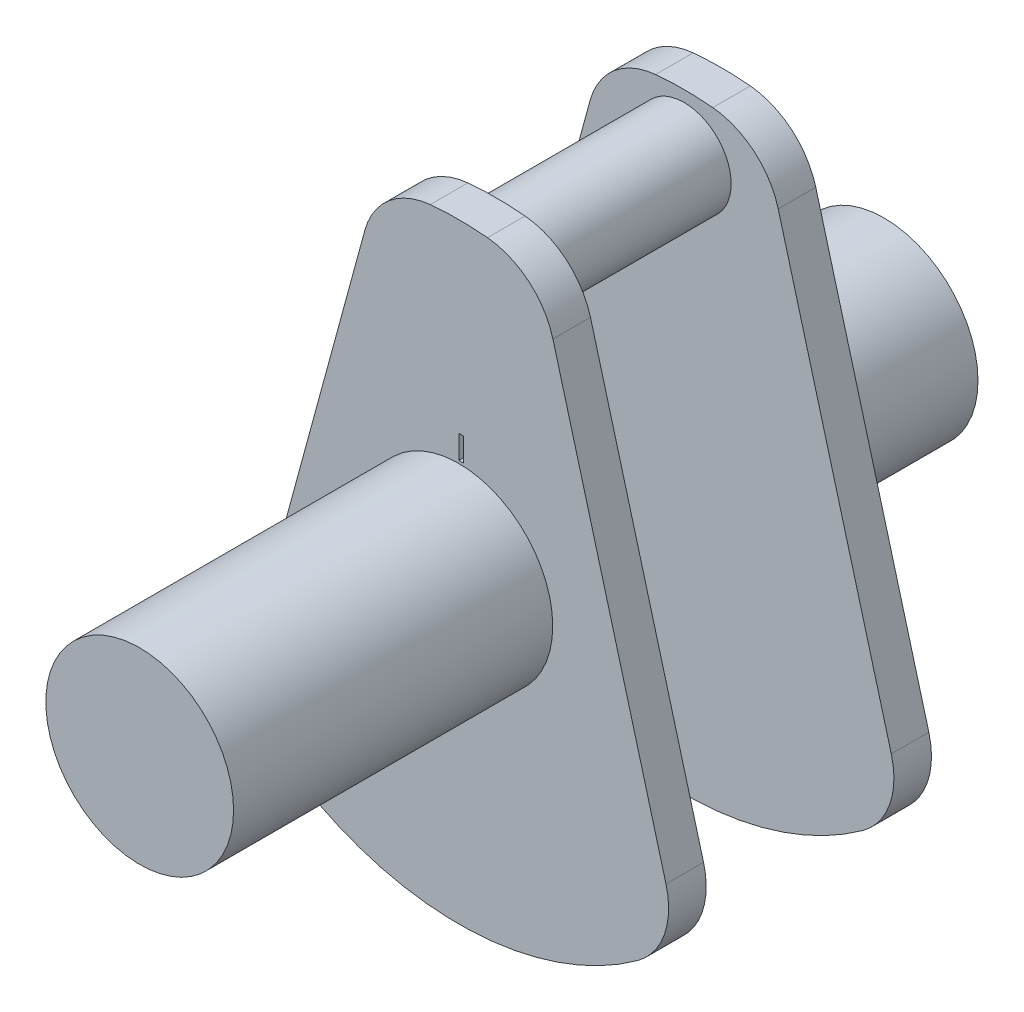
ISO-10303-21;
HEADER;
FILE_DESCRIPTION(('STEP AP214'),'2;1');
FILE_NAME('part.step','',(''),(''),'','','');
FILE_SCHEMA(('AUTOMOTIVE_DESIGN { 1 0 10303 214 1 1 1 1 }'));
ENDSEC;
DATA;
#1=APPLICATION_CONTEXT('core data for automotive mechanical design processes');
#2=APPLICATION_PROTOCOL_DEFINITION('international standard','automotive_design',2000,#1);
#3=PRODUCT_CONTEXT('',#1,'mechanical');
#4=PRODUCT('Part','Part','',(#3));
#5=PRODUCT_RELATED_PRODUCT_CATEGORY('part','',(#4));
#6=PRODUCT_DEFINITION_FORMATION('','',#4);
#7=PRODUCT_DEFINITION_CONTEXT('part definition',#1,'design');
#8=PRODUCT_DEFINITION('design','',#6,#7);
#9=PRODUCT_DEFINITION_SHAPE('','',#8);
#10=(LENGTH_UNIT() NAMED_UNIT(*) SI_UNIT(.MILLI.,.METRE.));
#11=(NAMED_UNIT(*) PLANE_ANGLE_UNIT() SI_UNIT($,.RADIAN.));
#12=(NAMED_UNIT(*) SI_UNIT($,.STERADIAN.) SOLID_ANGLE_UNIT());
#13=UNCERTAINTY_MEASURE_WITH_UNIT(LENGTH_MEASURE(1.E-05),#10,'distance_accuracy_value','');
#14=(GEOMETRIC_REPRESENTATION_CONTEXT(3) GLOBAL_UNCERTAINTY_ASSIGNED_CONTEXT((#13)) GLOBAL_UNIT_ASSIGNED_CONTEXT((#10,
#11,#12)) REPRESENTATION_CONTEXT('',''));
#15=CARTESIAN_POINT('',(0.,0.,0.));
#16=DIRECTION('',(0.,0.,1.));
#17=DIRECTION('',(1.,0.,0.));
#18=AXIS2_PLACEMENT_3D('',#15,#16,#17);
#19=CARTESIAN_POINT('',(0.46,4.87836038029172,0.8));
#20=DIRECTION('',(0.,0.,-1.));
#21=DIRECTION('',(-1.,0.,0.));
#22=AXIS2_PLACEMENT_3D('',#19,#20,#21);
#23=CYLINDRICAL_SURFACE('',#22,1.6);
#24=CARTESIAN_POINT('',(0.46,4.87836038029172,0.));
#25=DIRECTION('',(0.,0.,1.));
#26=DIRECTION('',(1.,0.,0.));
#27=AXIS2_PLACEMENT_3D('',#24,#25,#26);
#28=CIRCLE('',#27,1.6);
#29=CARTESIAN_POINT('',(2.00384320160388,5.29853673476862,0.));
#30=VERTEX_POINT('',#29);
#31=CARTESIAN_POINT('',(0.610204081632653,6.47129438201963,0.));
#32=VERTEX_POINT('',#31);
#33=EDGE_CURVE('E142',#30,#32,#28,.T.);
#34=ORIENTED_EDGE('',*,*,#33,.T.);
#35=DIRECTION('',(0.,0.,-1.));
#36=VECTOR('',#35,1.);
#37=CARTESIAN_POINT('',(0.610204081632653,6.47129438201963,0.8));
#38=LINE('',#37,#36);
#39=CARTESIAN_POINT('',(0.610204081632653,6.47129438201963,0.8));
#40=VERTEX_POINT('',#39);
#41=EDGE_CURVE('E40',#40,#32,#38,.T.);
#42=ORIENTED_EDGE('',*,*,#41,.F.);
#43=CARTESIAN_POINT('',(0.46,4.87836038029172,0.8));
#44=DIRECTION('',(0.,0.,1.));
#45=DIRECTION('',(1.,0.,0.));
#46=AXIS2_PLACEMENT_3D('',#43,#44,#45);
#47=CIRCLE('',#46,1.6);
#48=CARTESIAN_POINT('',(2.00384320160388,5.29853673476862,0.8));
#49=VERTEX_POINT('',#48);
#50=EDGE_CURVE('E158',#49,#40,#47,.T.);
#51=ORIENTED_EDGE('',*,*,#50,.F.);
#52=DIRECTION('',(0.,0.,-1.));
#53=VECTOR('',#52,1.);
#54=CARTESIAN_POINT('',(2.00384320160388,5.29853673476862,0.8));
#55=LINE('',#54,#53);
#56=EDGE_CURVE('E138',#49,#30,#55,.T.);
#57=ORIENTED_EDGE('',*,*,#56,.T.);
#58=EDGE_LOOP('',(#34,#42,#51,#57));
#59=FACE_BOUND('',#58,.T.);
#60=ADVANCED_FACE('F33',(#59),#23,.T.);
#61=CARTESIAN_POINT('',(0.,0.,0.8));
#62=DIRECTION('',(0.,0.,-1.));
#63=DIRECTION('',(-1.,0.,0.));
#64=AXIS2_PLACEMENT_3D('',#61,#62,#63);
#65=CYLINDRICAL_SURFACE('',#64,6.5);
#66=CARTESIAN_POINT('',(0.,0.,0.));
#67=DIRECTION('',(0.,0.,1.));
#68=DIRECTION('',(1.,0.,0.));
#69=AXIS2_PLACEMENT_3D('',#66,#67,#68);
#70=CIRCLE('',#69,6.5);
#71=CARTESIAN_POINT('',(-0.610204081632653,6.47129438201963,0.));
#72=VERTEX_POINT('',#71);
#73=EDGE_CURVE('E145',#32,#72,#70,.T.);
#74=ORIENTED_EDGE('',*,*,#73,.T.);
#75=DIRECTION('',(0.,0.,-1.));
#76=VECTOR('',#75,1.);
#77=CARTESIAN_POINT('',(-0.610204081632653,6.47129438201963,0.8));
#78=LINE('',#77,#76);
#79=CARTESIAN_POINT('',(-0.610204081632653,6.47129438201963,0.8));
#80=VERTEX_POINT('',#79);
#81=EDGE_CURVE('E168',#80,#72,#78,.T.);
#82=ORIENTED_EDGE('',*,*,#81,.F.);
#83=CARTESIAN_POINT('',(0.,0.,0.8));
#84=DIRECTION('',(0.,0.,1.));
#85=DIRECTION('',(1.,0.,0.));
#86=AXIS2_PLACEMENT_3D('',#83,#84,#85);
#87=CIRCLE('',#86,6.5);
#88=EDGE_CURVE('E98',#40,#80,#87,.T.);
#89=ORIENTED_EDGE('',*,*,#88,.F.);
#90=ORIENTED_EDGE('',*,*,#41,.T.);
#91=EDGE_LOOP('',(#74,#82,#89,#90));
#92=FACE_BOUND('',#91,.T.);
#93=ADVANCED_FACE('F171',(#92),#65,.T.);
#94=CARTESIAN_POINT('',(-0.46,4.87836038029172,0.8));
#95=DIRECTION('',(0.,0.,-1.));
#96=DIRECTION('',(-1.,0.,0.));
#97=AXIS2_PLACEMENT_3D('',#94,#95,#96);
#98=CYLINDRICAL_SURFACE('',#97,1.6);
#99=CARTESIAN_POINT('',(-0.46,4.87836038029172,0.));
#100=DIRECTION('',(0.,0.,1.));
#101=DIRECTION('',(-1.,0.,0.));
#102=AXIS2_PLACEMENT_3D('',#99,#100,#101);
#103=CIRCLE('',#102,1.6);
#104=CARTESIAN_POINT('',(-2.00384320160388,5.29853673476862,0.));
#105=VERTEX_POINT('',#104);
#106=EDGE_CURVE('E148',#72,#105,#103,.T.);
#107=ORIENTED_EDGE('',*,*,#106,.T.);
#108=DIRECTION('',(0.,0.,-1.));
#109=VECTOR('',#108,1.);
#110=CARTESIAN_POINT('',(-2.00384320160388,5.29853673476862,0.8));
#111=LINE('',#110,#109);
#112=CARTESIAN_POINT('',(-2.00384320160388,5.29853673476862,0.8));
#113=VERTEX_POINT('',#112);
#114=EDGE_CURVE('E165',#113,#105,#111,.T.);
#115=ORIENTED_EDGE('',*,*,#114,.F.);
#116=CARTESIAN_POINT('',(-0.46,4.87836038029172,0.8));
#117=DIRECTION('',(0.,0.,1.));
#118=DIRECTION('',(-1.,0.,0.));
#119=AXIS2_PLACEMENT_3D('',#116,#117,#118);
#120=CIRCLE('',#119,1.6);
#121=EDGE_CURVE('E189',#80,#113,#120,.T.);
#122=ORIENTED_EDGE('',*,*,#121,.F.);
#123=ORIENTED_EDGE('',*,*,#81,.T.);
#124=EDGE_LOOP('',(#107,#115,#122,#123));
#125=FACE_BOUND('',#124,.T.);
#126=ADVANCED_FACE('F182',(#125),#98,.T.);
#127=CARTESIAN_POINT('',(-2.00384320160388,5.29853673476862,0.8));
#128=DIRECTION('',(0.964902001002423,-0.26261022154806,0.));
#129=DIRECTION('',(0.26261022154806,0.964902001002423,0.));
#130=AXIS2_PLACEMENT_3D('',#127,#128,#129);
#131=PLANE('',#130);
#132=DIRECTION('',(-0.26261022154806,-0.964902001002423,0.));
#133=VECTOR('',#132,1.);
#134=CARTESIAN_POINT('',(-2.00384320160388,5.29853673476862,0.));
#135=LINE('',#134,#133);
#136=CARTESIAN_POINT('',(-4.41268219845804,-3.55219860392378,0.));
#137=VERTEX_POINT('',#136);
#138=EDGE_CURVE('E150',#105,#137,#135,.T.);
#139=ORIENTED_EDGE('',*,*,#138,.T.);
#140=DIRECTION('',(0.,0.,-1.));
#141=VECTOR('',#140,1.);
#142=CARTESIAN_POINT('',(-4.41268219845804,-3.55219860392378,0.8));
#143=LINE('',#142,#141);
#144=CARTESIAN_POINT('',(-4.41268219845804,-3.55219860392378,0.8));
#145=VERTEX_POINT('',#144);
#146=EDGE_CURVE('E162',#145,#137,#143,.T.);
#147=ORIENTED_EDGE('',*,*,#146,.F.);
#148=DIRECTION('',(-0.26261022154806,-0.964902001002423,0.));
#149=VECTOR('',#148,1.);
#150=CARTESIAN_POINT('',(-2.00384320160388,5.29853673476862,0.8));
#151=LINE('',#150,#149);
#152=EDGE_CURVE('E188',#113,#145,#151,.T.);
#153=ORIENTED_EDGE('',*,*,#152,.F.);
#154=ORIENTED_EDGE('',*,*,#114,.T.);
#155=EDGE_LOOP('',(#139,#147,#153,#154));
#156=FACE_BOUND('',#155,.T.);
#157=ADVANCED_FACE('F186',(#156),#131,.F.);
#158=CARTESIAN_POINT('',(-2.86883899685417,-3.97237495840068,0.8));
#159=DIRECTION('',(0.,0.,-1.));
#160=DIRECTION('',(-1.,0.,0.));
#161=AXIS2_PLACEMENT_3D('',#158,#159,#160);
#162=CYLINDRICAL_SURFACE('',#161,1.6);
#163=CARTESIAN_POINT('',(-2.86883899685417,-3.97237495840068,0.));
#164=DIRECTION('',(0.,0.,1.));
#165=DIRECTION('',(1.,0.,0.));
#166=AXIS2_PLACEMENT_3D('',#163,#164,#165);
#167=CIRCLE('',#166,1.6);
#168=CARTESIAN_POINT('',(-3.805602750929,-5.26947698563355,0.));
#169=VERTEX_POINT('',#168);
#170=EDGE_CURVE('E152',#137,#169,#167,.T.);
#171=ORIENTED_EDGE('',*,*,#170,.T.);
#172=DIRECTION('',(0.,0.,-1.));
#173=VECTOR('',#172,1.);
#174=CARTESIAN_POINT('',(-3.805602750929,-5.26947698563355,0.8));
#175=LINE('',#174,#173);
#176=CARTESIAN_POINT('',(-3.805602750929,-5.26947698563355,0.8));
#177=VERTEX_POINT('',#176);
#178=EDGE_CURVE('E133',#177,#169,#175,.T.);
#179=ORIENTED_EDGE('',*,*,#178,.F.);
#180=CARTESIAN_POINT('',(-2.86883899685417,-3.97237495840068,0.8));
#181=DIRECTION('',(0.,0.,1.));
#182=DIRECTION('',(1.,0.,0.));
#183=AXIS2_PLACEMENT_3D('',#180,#181,#182);
#184=CIRCLE('',#183,1.6);
#185=EDGE_CURVE('E121',#145,#177,#184,.T.);
#186=ORIENTED_EDGE('',*,*,#185,.F.);
#187=ORIENTED_EDGE('',*,*,#146,.T.);
#188=EDGE_LOOP('',(#171,#179,#186,#187));
#189=FACE_BOUND('',#188,.T.);
#190=ADVANCED_FACE('F431',(#189),#162,.T.);
#191=CARTESIAN_POINT('',(0.,0.,0.8));
#192=DIRECTION('',(0.,0.,-1.));
#193=DIRECTION('',(-1.,0.,0.));
#194=AXIS2_PLACEMENT_3D('',#191,#192,#193);
#195=CYLINDRICAL_SURFACE('',#194,6.5);
#196=CARTESIAN_POINT('',(0.,0.,0.));
#197=DIRECTION('',(0.,0.,1.));
#198=DIRECTION('',(1.,0.,0.));
#199=AXIS2_PLACEMENT_3D('',#196,#197,#198);
#200=CIRCLE('',#199,6.5);
#201=CARTESIAN_POINT('',(3.805602750929,-5.26947698563355,0.));
#202=VERTEX_POINT('',#201);
#203=EDGE_CURVE('E130',#169,#202,#200,.T.);
#204=ORIENTED_EDGE('',*,*,#203,.T.);
#205=DIRECTION('',(0.,0.,-1.));
#206=VECTOR('',#205,1.);
#207=CARTESIAN_POINT('',(3.805602750929,-5.26947698563355,0.8));
#208=LINE('',#207,#206);
#209=CARTESIAN_POINT('',(3.805602750929,-5.26947698563355,0.8));
#210=VERTEX_POINT('',#209);
#211=EDGE_CURVE('E127',#210,#202,#208,.T.);
#212=ORIENTED_EDGE('',*,*,#211,.F.);
#213=CARTESIAN_POINT('',(0.,0.,0.8));
#214=DIRECTION('',(0.,0.,1.));
#215=DIRECTION('',(1.,0.,0.));
#216=AXIS2_PLACEMENT_3D('',#213,#214,#215);
#217=CIRCLE('',#216,6.5);
#218=EDGE_CURVE('E114',#177,#210,#217,.T.);
#219=ORIENTED_EDGE('',*,*,#218,.F.);
#220=ORIENTED_EDGE('',*,*,#178,.T.);
#221=EDGE_LOOP('',(#204,#212,#219,#220));
#222=FACE_BOUND('',#221,.T.);
#223=ADVANCED_FACE('F128',(#222),#195,.T.);
#224=CARTESIAN_POINT('',(2.86883899685417,-3.97237495840068,0.8));
#225=DIRECTION('',(0.,0.,-1.));
#226=DIRECTION('',(-1.,0.,0.));
#227=AXIS2_PLACEMENT_3D('',#224,#225,#226);
#228=CYLINDRICAL_SURFACE('',#227,1.6);
#229=CARTESIAN_POINT('',(2.86883899685417,-3.97237495840068,0.));
#230=DIRECTION('',(0.,0.,1.));
#231=DIRECTION('',(-1.,0.,0.));
#232=AXIS2_PLACEMENT_3D('',#229,#230,#231);
#233=CIRCLE('',#232,1.6);
#234=CARTESIAN_POINT('',(4.41268219845804,-3.55219860392378,0.));
#235=VERTEX_POINT('',#234);
#236=EDGE_CURVE('E155',#202,#235,#233,.T.);
#237=ORIENTED_EDGE('',*,*,#236,.T.);
#238=DIRECTION('',(0.,0.,-1.));
#239=VECTOR('',#238,1.);
#240=CARTESIAN_POINT('',(4.41268219845804,-3.55219860392378,0.8));
#241=LINE('',#240,#239);
#242=CARTESIAN_POINT('',(4.41268219845804,-3.55219860392378,0.8));
#243=VERTEX_POINT('',#242);
#244=EDGE_CURVE('E134',#243,#235,#241,.T.);
#245=ORIENTED_EDGE('',*,*,#244,.F.);
#246=CARTESIAN_POINT('',(2.86883899685417,-3.97237495840068,0.8));
#247=DIRECTION('',(0.,0.,1.));
#248=DIRECTION('',(-1.,0.,0.));
#249=AXIS2_PLACEMENT_3D('',#246,#247,#248);
#250=CIRCLE('',#249,1.6);
#251=EDGE_CURVE('E118',#210,#243,#250,.T.);
#252=ORIENTED_EDGE('',*,*,#251,.F.);
#253=ORIENTED_EDGE('',*,*,#211,.T.);
#254=EDGE_LOOP('',(#237,#245,#252,#253));
#255=FACE_BOUND('',#254,.T.);
#256=ADVANCED_FACE('F136',(#255),#228,.T.);
#257=CARTESIAN_POINT('',(2.00384320160388,5.29853673476862,0.8));
#258=DIRECTION('',(-0.964902001002423,-0.26261022154806,0.));
#259=DIRECTION('',(0.26261022154806,-0.964902001002423,0.));
#260=AXIS2_PLACEMENT_3D('',#257,#258,#259);
#261=PLANE('',#260);
#262=DIRECTION('',(-0.26261022154806,0.964902001002422,0.));
#263=VECTOR('',#262,1.);
#264=CARTESIAN_POINT('',(2.00384320160388,5.29853673476862,0.));
#265=LINE('',#264,#263);
#266=EDGE_CURVE('E89',#235,#30,#265,.T.);
#267=ORIENTED_EDGE('',*,*,#266,.T.);
#268=ORIENTED_EDGE('',*,*,#56,.F.);
#269=DIRECTION('',(-0.26261022154806,0.964902001002422,0.));
#270=VECTOR('',#269,1.);
#271=CARTESIAN_POINT('',(2.00384320160388,5.29853673476862,0.8));
#272=LINE('',#271,#270);
#273=EDGE_CURVE('E56',#243,#49,#272,.T.);
#274=ORIENTED_EDGE('',*,*,#273,.F.);
#275=ORIENTED_EDGE('',*,*,#244,.T.);
#276=EDGE_LOOP('',(#267,#268,#274,#275));
#277=FACE_BOUND('',#276,.T.);
#278=ADVANCED_FACE('F439',(#277),#261,.F.);
#279=CARTESIAN_POINT('',(0.46,4.87836038029172,0.8));
#280=DIRECTION('',(0.,0.,1.));
#281=DIRECTION('',(1.,0.,0.));
#282=AXIS2_PLACEMENT_3D('',#279,#280,#281);
#283=PLANE('',#282);
#284=CARTESIAN_POINT('',(0.,5.26,0.8));
#285=DIRECTION('',(0.,0.,1.));
#286=DIRECTION('',(1.,0.,0.));
#287=AXIS2_PLACEMENT_3D('',#284,#285,#286);
#288=CIRCLE('',#287,1.);
#289=CARTESIAN_POINT('',(1.,5.26,0.8));
#290=VERTEX_POINT('',#289);
#291=EDGE_CURVE('E146',#290,#290,#288,.T.);
#292=ORIENTED_EDGE('',*,*,#291,.F.);
#293=EDGE_LOOP('',(#292));
#294=FACE_BOUND('',#293,.T.);
#295=ORIENTED_EDGE('',*,*,#50,.T.);
#296=ORIENTED_EDGE('',*,*,#88,.T.);
#297=ORIENTED_EDGE('',*,*,#121,.T.);
#298=ORIENTED_EDGE('',*,*,#152,.T.);
#299=ORIENTED_EDGE('',*,*,#185,.T.);
#300=ORIENTED_EDGE('',*,*,#218,.T.);
#301=ORIENTED_EDGE('',*,*,#251,.T.);
#302=ORIENTED_EDGE('',*,*,#273,.T.);
#303=EDGE_LOOP('',(#295,#296,#297,#298,#299,#300,#301,#302));
#304=FACE_BOUND('',#303,.T.);
#305=ADVANCED_FACE('F116',(#294,#304),#283,.T.);
#306=CARTESIAN_POINT('',(0.46,4.87836038029172,0.));
#307=DIRECTION('',(0.,0.,1.));
#308=DIRECTION('',(1.,0.,0.));
#309=AXIS2_PLACEMENT_3D('',#306,#307,#308);
#310=PLANE('',#309);
#311=CARTESIAN_POINT('',(0.,0.,0.));
#312=DIRECTION('',(0.,0.,1.));
#313=DIRECTION('',(1.,0.,0.));
#314=AXIS2_PLACEMENT_3D('',#311,#312,#313);
#315=CIRCLE('',#314,2.);
#316=CARTESIAN_POINT('',(2.,0.,0.));
#317=VERTEX_POINT('',#316);
#318=EDGE_CURVE('E11',#317,#317,#315,.F.);
#319=ORIENTED_EDGE('',*,*,#318,.F.);
#320=EDGE_LOOP('',(#319));
#321=FACE_BOUND('',#320,.T.);
#322=ORIENTED_EDGE('',*,*,#33,.F.);
#323=ORIENTED_EDGE('',*,*,#266,.F.);
#324=ORIENTED_EDGE('',*,*,#236,.F.);
#325=ORIENTED_EDGE('',*,*,#203,.F.);
#326=ORIENTED_EDGE('',*,*,#170,.F.);
#327=ORIENTED_EDGE('',*,*,#138,.F.);
#328=ORIENTED_EDGE('',*,*,#106,.F.);
#329=ORIENTED_EDGE('',*,*,#73,.F.);
#330=EDGE_LOOP('',(#322,#323,#324,#325,#326,#327,#328,#329));
#331=FACE_BOUND('',#330,.T.);
#332=ADVANCED_FACE('F176',(#321,#331),#310,.F.);
#333=CARTESIAN_POINT('',(0.,5.26,2.8));
#334=DIRECTION('',(0.,0.,-1.));
#335=DIRECTION('',(-1.,0.,0.));
#336=AXIS2_PLACEMENT_3D('',#333,#334,#335);
#337=CYLINDRICAL_SURFACE('',#336,1.);
#338=ORIENTED_EDGE('',*,*,#291,.T.);
#339=EDGE_LOOP('',(#338));
#340=FACE_BOUND('',#339,.T.);
#341=CARTESIAN_POINT('',(0.,5.26,4.8));
#342=DIRECTION('',(0.,0.,1.));
#343=DIRECTION('',(1.,0.,0.));
#344=AXIS2_PLACEMENT_3D('',#341,#342,#343);
#345=CIRCLE('',#344,1.);
#346=CARTESIAN_POINT('',(1.,5.26,4.8));
#347=VERTEX_POINT('',#346);
#348=EDGE_CURVE('E253',#347,#347,#345,.T.);
#349=ORIENTED_EDGE('',*,*,#348,.F.);
#350=EDGE_LOOP('',(#349));
#351=FACE_BOUND('',#350,.T.);
#352=ADVANCED_FACE('F444',(#340,#351),#337,.T.);
#353=CARTESIAN_POINT('',(0.,0.,-3.46));
#354=DIRECTION('',(0.,0.,1.));
#355=DIRECTION('',(1.,0.,0.));
#356=AXIS2_PLACEMENT_3D('',#353,#354,#355);
#357=CYLINDRICAL_SURFACE('',#356,2.);
#358=CARTESIAN_POINT('',(0.,0.,-3.46));
#359=DIRECTION('',(0.,0.,-1.));
#360=DIRECTION('',(-1.,0.,0.));
#361=AXIS2_PLACEMENT_3D('',#358,#359,#360);
#362=CIRCLE('',#361,2.);
#363=CARTESIAN_POINT('',(-2.,0.,-3.46));
#364=VERTEX_POINT('',#363);
#365=EDGE_CURVE('E197',#364,#364,#362,.T.);
#366=ORIENTED_EDGE('',*,*,#365,.F.);
#367=EDGE_LOOP('',(#366));
#368=FACE_BOUND('',#367,.T.);
#369=ORIENTED_EDGE('',*,*,#318,.T.);
#370=EDGE_LOOP('',(#369));
#371=FACE_BOUND('',#370,.T.);
#372=ADVANCED_FACE('F451',(#368,#371),#357,.T.);
#373=CARTESIAN_POINT('',(0.,0.,-3.46));
#374=DIRECTION('',(0.,0.,-1.));
#375=DIRECTION('',(-1.,0.,0.));
#376=AXIS2_PLACEMENT_3D('',#373,#374,#375);
#377=PLANE('',#376);
#378=ORIENTED_EDGE('',*,*,#365,.T.);
#379=EDGE_LOOP('',(#378));
#380=FACE_BOUND('',#379,.T.);
#381=ADVANCED_FACE('F455',(#380),#377,.T.);
#382=CARTESIAN_POINT('',(0.46,4.87836038029172,4.8));
#383=DIRECTION('',(0.,0.,1.));
#384=DIRECTION('',(-1.,0.,0.));
#385=AXIS2_PLACEMENT_3D('',#382,#383,#384);
#386=CYLINDRICAL_SURFACE('',#385,1.6);
#387=CARTESIAN_POINT('',(0.46,4.87836038029172,5.6));
#388=DIRECTION('',(0.,0.,1.));
#389=DIRECTION('',(1.,0.,0.));
#390=AXIS2_PLACEMENT_3D('',#387,#388,#389);
#391=CIRCLE('',#390,1.6);
#392=CARTESIAN_POINT('',(2.00384320160388,5.29853673476862,5.6));
#393=VERTEX_POINT('',#392);
#394=CARTESIAN_POINT('',(0.610204081632653,6.47129438201963,5.6));
#395=VERTEX_POINT('',#394);
#396=EDGE_CURVE('E250',#393,#395,#391,.T.);
#397=ORIENTED_EDGE('',*,*,#396,.F.);
#398=DIRECTION('',(0.,0.,1.));
#399=VECTOR('',#398,1.);
#400=CARTESIAN_POINT('',(2.00384320160388,5.29853673476862,4.8));
#401=LINE('',#400,#399);
#402=CARTESIAN_POINT('',(2.00384320160388,5.29853673476862,4.8));
#403=VERTEX_POINT('',#402);
#404=EDGE_CURVE('E224',#403,#393,#401,.T.);
#405=ORIENTED_EDGE('',*,*,#404,.F.);
#406=CARTESIAN_POINT('',(0.46,4.87836038029172,4.8));
#407=DIRECTION('',(0.,0.,1.));
#408=DIRECTION('',(1.,0.,0.));
#409=AXIS2_PLACEMENT_3D('',#406,#407,#408);
#410=CIRCLE('',#409,1.6);
#411=CARTESIAN_POINT('',(0.610204081632653,6.47129438201963,4.8));
#412=VERTEX_POINT('',#411);
#413=EDGE_CURVE('E231',#403,#412,#410,.T.);
#414=ORIENTED_EDGE('',*,*,#413,.T.);
#415=DIRECTION('',(0.,0.,1.));
#416=VECTOR('',#415,1.);
#417=CARTESIAN_POINT('',(0.610204081632653,6.47129438201963,4.8));
#418=LINE('',#417,#416);
#419=EDGE_CURVE('E203',#412,#395,#418,.T.);
#420=ORIENTED_EDGE('',*,*,#419,.T.);
#421=EDGE_LOOP('',(#397,#405,#414,#420));
#422=FACE_BOUND('',#421,.T.);
#423=ADVANCED_FACE('F386',(#422),#386,.T.);
#424=CARTESIAN_POINT('',(0.,0.,4.8));
#425=DIRECTION('',(0.,0.,1.));
#426=DIRECTION('',(-1.,0.,0.));
#427=AXIS2_PLACEMENT_3D('',#424,#425,#426);
#428=CYLINDRICAL_SURFACE('',#427,6.5);
#429=CARTESIAN_POINT('',(0.,0.,5.6));
#430=DIRECTION('',(0.,0.,1.));
#431=DIRECTION('',(1.,0.,0.));
#432=AXIS2_PLACEMENT_3D('',#429,#430,#431);
#433=CIRCLE('',#432,6.5);
#434=CARTESIAN_POINT('',(-0.610204081632653,6.47129438201963,5.6));
#435=VERTEX_POINT('',#434);
#436=EDGE_CURVE('E247',#395,#435,#433,.T.);
#437=ORIENTED_EDGE('',*,*,#436,.F.);
#438=ORIENTED_EDGE('',*,*,#419,.F.);
#439=CARTESIAN_POINT('',(0.,0.,4.8));
#440=DIRECTION('',(0.,0.,1.));
#441=DIRECTION('',(1.,0.,0.));
#442=AXIS2_PLACEMENT_3D('',#439,#440,#441);
#443=CIRCLE('',#442,6.5);
#444=CARTESIAN_POINT('',(-0.610204081632653,6.47129438201963,4.8));
#445=VERTEX_POINT('',#444);
#446=EDGE_CURVE('E271',#412,#445,#443,.T.);
#447=ORIENTED_EDGE('',*,*,#446,.T.);
#448=DIRECTION('',(0.,0.,1.));
#449=VECTOR('',#448,1.);
#450=CARTESIAN_POINT('',(-0.610204081632653,6.47129438201963,4.8));
#451=LINE('',#450,#449);
#452=EDGE_CURVE('E206',#445,#435,#451,.T.);
#453=ORIENTED_EDGE('',*,*,#452,.T.);
#454=EDGE_LOOP('',(#437,#438,#447,#453));
#455=FACE_BOUND('',#454,.T.);
#456=ADVANCED_FACE('F389',(#455),#428,.T.);
#457=CARTESIAN_POINT('',(-0.46,4.87836038029172,4.8));
#458=DIRECTION('',(0.,0.,1.));
#459=DIRECTION('',(-1.,0.,0.));
#460=AXIS2_PLACEMENT_3D('',#457,#458,#459);
#461=CYLINDRICAL_SURFACE('',#460,1.6);
#462=CARTESIAN_POINT('',(-0.46,4.87836038029172,5.6));
#463=DIRECTION('',(0.,0.,1.));
#464=DIRECTION('',(-1.,0.,0.));
#465=AXIS2_PLACEMENT_3D('',#462,#463,#464);
#466=CIRCLE('',#465,1.6);
#467=CARTESIAN_POINT('',(-2.00384320160388,5.29853673476862,5.6));
#468=VERTEX_POINT('',#467);
#469=EDGE_CURVE('E244',#435,#468,#466,.T.);
#470=ORIENTED_EDGE('',*,*,#469,.F.);
#471=ORIENTED_EDGE('',*,*,#452,.F.);
#472=CARTESIAN_POINT('',(-0.46,4.87836038029172,4.8));
#473=DIRECTION('',(0.,0.,1.));
#474=DIRECTION('',(-1.,0.,0.));
#475=AXIS2_PLACEMENT_3D('',#472,#473,#474);
#476=CIRCLE('',#475,1.6);
#477=CARTESIAN_POINT('',(-2.00384320160388,5.29853673476862,4.8));
#478=VERTEX_POINT('',#477);
#479=EDGE_CURVE('E268',#445,#478,#476,.T.);
#480=ORIENTED_EDGE('',*,*,#479,.T.);
#481=DIRECTION('',(0.,0.,1.));
#482=VECTOR('',#481,1.);
#483=CARTESIAN_POINT('',(-2.00384320160388,5.29853673476862,4.8));
#484=LINE('',#483,#482);
#485=EDGE_CURVE('E209',#478,#468,#484,.T.);
#486=ORIENTED_EDGE('',*,*,#485,.T.);
#487=EDGE_LOOP('',(#470,#471,#480,#486));
#488=FACE_BOUND('',#487,.T.);
#489=ADVANCED_FACE('F392',(#488),#461,.T.);
#490=CARTESIAN_POINT('',(-2.00384320160388,5.29853673476862,4.8));
#491=DIRECTION('',(0.964902001002423,-0.26261022154806,0.));
#492=DIRECTION('',(0.26261022154806,0.964902001002423,0.));
#493=AXIS2_PLACEMENT_3D('',#490,#491,#492);
#494=PLANE('',#493);
#495=DIRECTION('',(-0.26261022154806,-0.964902001002423,0.));
#496=VECTOR('',#495,1.);
#497=CARTESIAN_POINT('',(-2.00384320160388,5.29853673476862,5.6));
#498=LINE('',#497,#496);
#499=CARTESIAN_POINT('',(-4.41268219845804,-3.55219860392378,5.6));
#500=VERTEX_POINT('',#499);
#501=EDGE_CURVE('E241',#468,#500,#498,.T.);
#502=ORIENTED_EDGE('',*,*,#501,.F.);
#503=ORIENTED_EDGE('',*,*,#485,.F.);
#504=DIRECTION('',(-0.26261022154806,-0.964902001002423,0.));
#505=VECTOR('',#504,1.);
#506=CARTESIAN_POINT('',(-2.00384320160388,5.29853673476862,4.8));
#507=LINE('',#506,#505);
#508=CARTESIAN_POINT('',(-4.41268219845804,-3.55219860392378,4.8));
#509=VERTEX_POINT('',#508);
#510=EDGE_CURVE('E265',#478,#509,#507,.T.);
#511=ORIENTED_EDGE('',*,*,#510,.T.);
#512=DIRECTION('',(0.,0.,1.));
#513=VECTOR('',#512,1.);
#514=CARTESIAN_POINT('',(-4.41268219845804,-3.55219860392378,4.8));
#515=LINE('',#514,#513);
#516=EDGE_CURVE('E212',#509,#500,#515,.T.);
#517=ORIENTED_EDGE('',*,*,#516,.T.);
#518=EDGE_LOOP('',(#502,#503,#511,#517));
#519=FACE_BOUND('',#518,.T.);
#520=ADVANCED_FACE('F395',(#519),#494,.F.);
#521=CARTESIAN_POINT('',(-2.86883899685417,-3.97237495840068,4.8));
#522=DIRECTION('',(0.,0.,1.));
#523=DIRECTION('',(-1.,0.,0.));
#524=AXIS2_PLACEMENT_3D('',#521,#522,#523);
#525=CYLINDRICAL_SURFACE('',#524,1.6);
#526=CARTESIAN_POINT('',(-2.86883899685417,-3.97237495840068,5.6));
#527=DIRECTION('',(0.,0.,1.));
#528=DIRECTION('',(1.,0.,0.));
#529=AXIS2_PLACEMENT_3D('',#526,#527,#528);
#530=CIRCLE('',#529,1.6);
#531=CARTESIAN_POINT('',(-3.805602750929,-5.26947698563355,5.6));
#532=VERTEX_POINT('',#531);
#533=EDGE_CURVE('E238',#500,#532,#530,.T.);
#534=ORIENTED_EDGE('',*,*,#533,.F.);
#535=ORIENTED_EDGE('',*,*,#516,.F.);
#536=CARTESIAN_POINT('',(-2.86883899685417,-3.97237495840068,4.8));
#537=DIRECTION('',(0.,0.,1.));
#538=DIRECTION('',(1.,0.,0.));
#539=AXIS2_PLACEMENT_3D('',#536,#537,#538);
#540=CIRCLE('',#539,1.6);
#541=CARTESIAN_POINT('',(-3.805602750929,-5.26947698563355,4.8));
#542=VERTEX_POINT('',#541);
#543=EDGE_CURVE('E262',#509,#542,#540,.T.);
#544=ORIENTED_EDGE('',*,*,#543,.T.);
#545=DIRECTION('',(0.,0.,1.));
#546=VECTOR('',#545,1.);
#547=CARTESIAN_POINT('',(-3.805602750929,-5.26947698563355,4.8));
#548=LINE('',#547,#546);
#549=EDGE_CURVE('E215',#542,#532,#548,.T.);
#550=ORIENTED_EDGE('',*,*,#549,.T.);
#551=EDGE_LOOP('',(#534,#535,#544,#550));
#552=FACE_BOUND('',#551,.T.);
#553=ADVANCED_FACE('F398',(#552),#525,.T.);
#554=CARTESIAN_POINT('',(0.,0.,4.8));
#555=DIRECTION('',(0.,0.,1.));
#556=DIRECTION('',(-1.,0.,0.));
#557=AXIS2_PLACEMENT_3D('',#554,#555,#556);
#558=CYLINDRICAL_SURFACE('',#557,6.5);
#559=CARTESIAN_POINT('',(0.,0.,5.6));
#560=DIRECTION('',(0.,0.,1.));
#561=DIRECTION('',(1.,0.,0.));
#562=AXIS2_PLACEMENT_3D('',#559,#560,#561);
#563=CIRCLE('',#562,6.5);
#564=CARTESIAN_POINT('',(3.805602750929,-5.26947698563355,5.6));
#565=VERTEX_POINT('',#564);
#566=EDGE_CURVE('E235',#532,#565,#563,.T.);
#567=ORIENTED_EDGE('',*,*,#566,.F.);
#568=ORIENTED_EDGE('',*,*,#549,.F.);
#569=CARTESIAN_POINT('',(0.,0.,4.8));
#570=DIRECTION('',(0.,0.,1.));
#571=DIRECTION('',(1.,0.,0.));
#572=AXIS2_PLACEMENT_3D('',#569,#570,#571);
#573=CIRCLE('',#572,6.5);
#574=CARTESIAN_POINT('',(3.805602750929,-5.26947698563355,4.8));
#575=VERTEX_POINT('',#574);
#576=EDGE_CURVE('E259',#542,#575,#573,.T.);
#577=ORIENTED_EDGE('',*,*,#576,.T.);
#578=DIRECTION('',(0.,0.,1.));
#579=VECTOR('',#578,1.);
#580=CARTESIAN_POINT('',(3.805602750929,-5.26947698563355,4.8));
#581=LINE('',#580,#579);
#582=EDGE_CURVE('E218',#575,#565,#581,.T.);
#583=ORIENTED_EDGE('',*,*,#582,.T.);
#584=EDGE_LOOP('',(#567,#568,#577,#583));
#585=FACE_BOUND('',#584,.T.);
#586=ADVANCED_FACE('F401',(#585),#558,.T.);
#587=CARTESIAN_POINT('',(2.86883899685417,-3.97237495840068,4.8));
#588=DIRECTION('',(0.,0.,1.));
#589=DIRECTION('',(-1.,0.,0.));
#590=AXIS2_PLACEMENT_3D('',#587,#588,#589);
#591=CYLINDRICAL_SURFACE('',#590,1.6);
#592=CARTESIAN_POINT('',(2.86883899685417,-3.97237495840068,5.6));
#593=DIRECTION('',(0.,0.,1.));
#594=DIRECTION('',(-1.,0.,0.));
#595=AXIS2_PLACEMENT_3D('',#592,#593,#594);
#596=CIRCLE('',#595,1.6);
#597=CARTESIAN_POINT('',(4.41268219845804,-3.55219860392378,5.6));
#598=VERTEX_POINT('',#597);
#599=EDGE_CURVE('E232',#565,#598,#596,.T.);
#600=ORIENTED_EDGE('',*,*,#599,.F.);
#601=ORIENTED_EDGE('',*,*,#582,.F.);
#602=CARTESIAN_POINT('',(2.86883899685417,-3.97237495840068,4.8));
#603=DIRECTION('',(0.,0.,1.));
#604=DIRECTION('',(-1.,0.,0.));
#605=AXIS2_PLACEMENT_3D('',#602,#603,#604);
#606=CIRCLE('',#605,1.6);
#607=CARTESIAN_POINT('',(4.41268219845804,-3.55219860392378,4.8));
#608=VERTEX_POINT('',#607);
#609=EDGE_CURVE('E256',#575,#608,#606,.T.);
#610=ORIENTED_EDGE('',*,*,#609,.T.);
#611=DIRECTION('',(0.,0.,1.));
#612=VECTOR('',#611,1.);
#613=CARTESIAN_POINT('',(4.41268219845804,-3.55219860392378,4.8));
#614=LINE('',#613,#612);
#615=EDGE_CURVE('E221',#608,#598,#614,.T.);
#616=ORIENTED_EDGE('',*,*,#615,.T.);
#617=EDGE_LOOP('',(#600,#601,#610,#616));
#618=FACE_BOUND('',#617,.T.);
#619=ADVANCED_FACE('F404',(#618),#591,.T.);
#620=CARTESIAN_POINT('',(2.00384320160388,5.29853673476862,4.8));
#621=DIRECTION('',(-0.964902001002423,-0.26261022154806,0.));
#622=DIRECTION('',(0.26261022154806,-0.964902001002423,0.));
#623=AXIS2_PLACEMENT_3D('',#620,#621,#622);
#624=PLANE('',#623);
#625=DIRECTION('',(-0.26261022154806,0.964902001002422,0.));
#626=VECTOR('',#625,1.);
#627=CARTESIAN_POINT('',(2.00384320160388,5.29853673476862,5.6));
#628=LINE('',#627,#626);
#629=EDGE_CURVE('E228',#598,#393,#628,.T.);
#630=ORIENTED_EDGE('',*,*,#629,.F.);
#631=ORIENTED_EDGE('',*,*,#615,.F.);
#632=DIRECTION('',(-0.26261022154806,0.964902001002422,0.));
#633=VECTOR('',#632,1.);
#634=CARTESIAN_POINT('',(2.00384320160388,5.29853673476862,4.8));
#635=LINE('',#634,#633);
#636=EDGE_CURVE('E227',#608,#403,#635,.T.);
#637=ORIENTED_EDGE('',*,*,#636,.T.);
#638=ORIENTED_EDGE('',*,*,#404,.T.);
#639=EDGE_LOOP('',(#630,#631,#637,#638));
#640=FACE_BOUND('',#639,.T.);
#641=ADVANCED_FACE('F383',(#640),#624,.F.);
#642=CARTESIAN_POINT('',(0.46,4.87836038029172,4.8));
#643=DIRECTION('',(0.,0.,-1.));
#644=DIRECTION('',(1.,0.,0.));
#645=AXIS2_PLACEMENT_3D('',#642,#643,#644);
#646=PLANE('',#645);
#647=ORIENTED_EDGE('',*,*,#348,.T.);
#648=EDGE_LOOP('',(#647));
#649=FACE_BOUND('',#648,.T.);
#650=ORIENTED_EDGE('',*,*,#413,.F.);
#651=ORIENTED_EDGE('',*,*,#636,.F.);
#652=ORIENTED_EDGE('',*,*,#609,.F.);
#653=ORIENTED_EDGE('',*,*,#576,.F.);
#654=ORIENTED_EDGE('',*,*,#543,.F.);
#655=ORIENTED_EDGE('',*,*,#510,.F.);
#656=ORIENTED_EDGE('',*,*,#479,.F.);
#657=ORIENTED_EDGE('',*,*,#446,.F.);
#658=EDGE_LOOP('',(#650,#651,#652,#653,#654,#655,#656,#657));
#659=FACE_BOUND('',#658,.T.);
#660=ADVANCED_FACE('F406',(#649,#659),#646,.T.);
#661=CARTESIAN_POINT('',(0.46,4.87836038029172,5.6));
#662=DIRECTION('',(0.,0.,-1.));
#663=DIRECTION('',(1.,0.,0.));
#664=AXIS2_PLACEMENT_3D('',#661,#662,#663);
#665=PLANE('',#664);
#666=DIRECTION('',(1.,0.,0.));
#667=VECTOR('',#666,1.);
#668=CARTESIAN_POINT('',(0.,2.05622683110431,5.6));
#669=LINE('',#668,#667);
#670=CARTESIAN_POINT('',(0.,2.05622683110431,5.6));
#671=VERTEX_POINT('',#670);
#672=CARTESIAN_POINT('',(0.1,2.05622683110431,5.6));
#673=VERTEX_POINT('',#672);
#674=EDGE_CURVE('E299',#671,#673,#669,.T.);
#675=ORIENTED_EDGE('',*,*,#674,.F.);
#676=DIRECTION('',(0.,-1.,0.));
#677=VECTOR('',#676,1.);
#678=CARTESIAN_POINT('',(0.,2.55622683110431,5.6));
#679=LINE('',#678,#677);
#680=CARTESIAN_POINT('',(0.,2.55622683110431,5.6));
#681=VERTEX_POINT('',#680);
#682=EDGE_CURVE('E47',#681,#671,#679,.T.);
#683=ORIENTED_EDGE('',*,*,#682,.F.);
#684=DIRECTION('',(-1.,0.,0.));
#685=VECTOR('',#684,1.);
#686=CARTESIAN_POINT('',(0.,2.55622683110431,5.6));
#687=LINE('',#686,#685);
#688=CARTESIAN_POINT('',(0.1,2.55622683110431,5.6));
#689=VERTEX_POINT('',#688);
#690=EDGE_CURVE('E292',#689,#681,#687,.T.);
#691=ORIENTED_EDGE('',*,*,#690,.F.);
#692=DIRECTION('',(0.,1.,0.));
#693=VECTOR('',#692,1.);
#694=CARTESIAN_POINT('',(0.1,2.55622683110431,5.6));
#695=LINE('',#694,#693);
#696=EDGE_CURVE('E296',#673,#689,#695,.T.);
#697=ORIENTED_EDGE('',*,*,#696,.F.);
#698=EDGE_LOOP('',(#675,#683,#691,#697));
#699=FACE_BOUND('',#698,.T.);
#700=CARTESIAN_POINT('',(0.,0.,5.6));
#701=DIRECTION('',(0.,0.,1.));
#702=DIRECTION('',(1.,0.,0.));
#703=AXIS2_PLACEMENT_3D('',#700,#701,#702);
#704=CIRCLE('',#703,2.);
#705=CARTESIAN_POINT('',(2.,0.,5.6));
#706=VERTEX_POINT('',#705);
#707=EDGE_CURVE('E200',#706,#706,#704,.F.);
#708=ORIENTED_EDGE('',*,*,#707,.T.);
#709=EDGE_LOOP('',(#708));
#710=FACE_BOUND('',#709,.T.);
#711=ORIENTED_EDGE('',*,*,#396,.T.);
#712=ORIENTED_EDGE('',*,*,#436,.T.);
#713=ORIENTED_EDGE('',*,*,#469,.T.);
#714=ORIENTED_EDGE('',*,*,#501,.T.);
#715=ORIENTED_EDGE('',*,*,#533,.T.);
#716=ORIENTED_EDGE('',*,*,#566,.T.);
#717=ORIENTED_EDGE('',*,*,#599,.T.);
#718=ORIENTED_EDGE('',*,*,#629,.T.);
#719=EDGE_LOOP('',(#711,#712,#713,#714,#715,#716,#717,#718));
#720=FACE_BOUND('',#719,.T.);
#721=ADVANCED_FACE('F380',(#699,#710,#720),#665,.F.);
#722=CARTESIAN_POINT('',(0.,0.,9.06));
#723=DIRECTION('',(0.,0.,-1.));
#724=DIRECTION('',(1.,0.,0.));
#725=AXIS2_PLACEMENT_3D('',#722,#723,#724);
#726=CYLINDRICAL_SURFACE('',#725,2.);
#727=ORIENTED_EDGE('',*,*,#707,.F.);
#728=EDGE_LOOP('',(#727));
#729=FACE_BOUND('',#728,.T.);
#730=CARTESIAN_POINT('',(0.,0.,12.4));
#731=DIRECTION('',(0.,0.,1.));
#732=DIRECTION('',(1.,0.,0.));
#733=AXIS2_PLACEMENT_3D('',#730,#731,#732);
#734=CIRCLE('',#733,2.);
#735=CARTESIAN_POINT('',(2.,0.,12.4));
#736=VERTEX_POINT('',#735);
#737=EDGE_CURVE('E278',#736,#736,#734,.T.);
#738=ORIENTED_EDGE('',*,*,#737,.F.);
#739=EDGE_LOOP('',(#738));
#740=FACE_BOUND('',#739,.T.);
#741=ADVANCED_FACE('F415',(#729,#740),#726,.T.);
#742=CARTESIAN_POINT('',(0.,0.,12.4));
#743=DIRECTION('',(0.,0.,1.));
#744=DIRECTION('',(1.,0.,0.));
#745=AXIS2_PLACEMENT_3D('',#742,#743,#744);
#746=PLANE('',#745);
#747=ORIENTED_EDGE('',*,*,#737,.T.);
#748=EDGE_LOOP('',(#747));
#749=FACE_BOUND('',#748,.T.);
#750=ADVANCED_FACE('F495',(#749),#746,.T.);
#751=CARTESIAN_POINT('',(0.,2.55622683110431,5.5));
#752=DIRECTION('',(-1.,0.,0.));
#753=DIRECTION('',(0.,0.,1.));
#754=AXIS2_PLACEMENT_3D('',#751,#752,#753);
#755=PLANE('',#754);
#756=ORIENTED_EDGE('',*,*,#682,.T.);
#757=DIRECTION('',(0.,0.,1.));
#758=VECTOR('',#757,1.);
#759=CARTESIAN_POINT('',(0.,2.05622683110431,5.5));
#760=LINE('',#759,#758);
#761=CARTESIAN_POINT('',(0.,2.05622683110431,5.5));
#762=VERTEX_POINT('',#761);
#763=EDGE_CURVE('E282',#762,#671,#760,.T.);
#764=ORIENTED_EDGE('',*,*,#763,.F.);
#765=DIRECTION('',(0.,-1.,0.));
#766=VECTOR('',#765,1.);
#767=CARTESIAN_POINT('',(0.,2.55622683110431,5.5));
#768=LINE('',#767,#766);
#769=CARTESIAN_POINT('',(0.,2.55622683110431,5.5));
#770=VERTEX_POINT('',#769);
#771=EDGE_CURVE('E295',#770,#762,#768,.T.);
#772=ORIENTED_EDGE('',*,*,#771,.F.);
#773=DIRECTION('',(0.,0.,1.));
#774=VECTOR('',#773,1.);
#775=CARTESIAN_POINT('',(0.,2.55622683110431,5.5));
#776=LINE('',#775,#774);
#777=EDGE_CURVE('E281',#770,#681,#776,.T.);
#778=ORIENTED_EDGE('',*,*,#777,.T.);
#779=EDGE_LOOP('',(#756,#764,#772,#778));
#780=FACE_BOUND('',#779,.T.);
#781=ADVANCED_FACE('F322',(#780),#755,.F.);
#782=CARTESIAN_POINT('',(0.,2.55622683110431,5.5));
#783=DIRECTION('',(0.,1.,0.));
#784=DIRECTION('',(0.,0.,1.));
#785=AXIS2_PLACEMENT_3D('',#782,#783,#784);
#786=PLANE('',#785);
#787=ORIENTED_EDGE('',*,*,#690,.T.);
#788=ORIENTED_EDGE('',*,*,#777,.F.);
#789=DIRECTION('',(-1.,0.,0.));
#790=VECTOR('',#789,1.);
#791=CARTESIAN_POINT('',(0.,2.55622683110431,5.5));
#792=LINE('',#791,#790);
#793=CARTESIAN_POINT('',(0.1,2.55622683110431,5.5));
#794=VERTEX_POINT('',#793);
#795=EDGE_CURVE('E285',#794,#770,#792,.T.);
#796=ORIENTED_EDGE('',*,*,#795,.F.);
#797=DIRECTION('',(0.,0.,1.));
#798=VECTOR('',#797,1.);
#799=CARTESIAN_POINT('',(0.1,2.55622683110431,5.5));
#800=LINE('',#799,#798);
#801=EDGE_CURVE('E288',#794,#689,#800,.T.);
#802=ORIENTED_EDGE('',*,*,#801,.T.);
#803=EDGE_LOOP('',(#787,#788,#796,#802));
#804=FACE_BOUND('',#803,.T.);
#805=ADVANCED_FACE('F516',(#804),#786,.F.);
#806=CARTESIAN_POINT('',(0.1,2.55622683110431,5.5));
#807=DIRECTION('',(1.,0.,0.));
#808=DIRECTION('',(0.,1.,0.));
#809=AXIS2_PLACEMENT_3D('',#806,#807,#808);
#810=PLANE('',#809);
#811=ORIENTED_EDGE('',*,*,#696,.T.);
#812=ORIENTED_EDGE('',*,*,#801,.F.);
#813=DIRECTION('',(0.,1.,0.));
#814=VECTOR('',#813,1.);
#815=CARTESIAN_POINT('',(0.1,2.55622683110431,5.5));
#816=LINE('',#815,#814);
#817=CARTESIAN_POINT('',(0.1,2.05622683110431,5.5));
#818=VERTEX_POINT('',#817);
#819=EDGE_CURVE('E305',#818,#794,#816,.T.);
#820=ORIENTED_EDGE('',*,*,#819,.F.);
#821=DIRECTION('',(0.,0.,1.));
#822=VECTOR('',#821,1.);
#823=CARTESIAN_POINT('',(0.1,2.05622683110431,5.5));
#824=LINE('',#823,#822);
#825=EDGE_CURVE('E284',#818,#673,#824,.T.);
#826=ORIENTED_EDGE('',*,*,#825,.T.);
#827=EDGE_LOOP('',(#811,#812,#820,#826));
#828=FACE_BOUND('',#827,.T.);
#829=ADVANCED_FACE('F525',(#828),#810,.F.);
#830=CARTESIAN_POINT('',(0.,2.05622683110431,5.5));
#831=DIRECTION('',(0.,-1.,0.));
#832=DIRECTION('',(0.,0.,-1.));
#833=AXIS2_PLACEMENT_3D('',#830,#831,#832);
#834=PLANE('',#833);
#835=ORIENTED_EDGE('',*,*,#674,.T.);
#836=ORIENTED_EDGE('',*,*,#825,.F.);
#837=DIRECTION('',(1.,0.,0.));
#838=VECTOR('',#837,1.);
#839=CARTESIAN_POINT('',(0.,2.05622683110431,5.5));
#840=LINE('',#839,#838);
#841=EDGE_CURVE('E308',#762,#818,#840,.T.);
#842=ORIENTED_EDGE('',*,*,#841,.F.);
#843=ORIENTED_EDGE('',*,*,#763,.T.);
#844=EDGE_LOOP('',(#835,#836,#842,#843));
#845=FACE_BOUND('',#844,.T.);
#846=ADVANCED_FACE('F534',(#845),#834,.F.);
#847=CARTESIAN_POINT('',(0.,0.,5.5));
#848=DIRECTION('',(0.,0.,1.));
#849=DIRECTION('',(1.,0.,0.));
#850=AXIS2_PLACEMENT_3D('',#847,#848,#849);
#851=PLANE('',#850);
#852=ORIENTED_EDGE('',*,*,#771,.T.);
#853=ORIENTED_EDGE('',*,*,#841,.T.);
#854=ORIENTED_EDGE('',*,*,#819,.T.);
#855=ORIENTED_EDGE('',*,*,#795,.T.);
#856=EDGE_LOOP('',(#852,#853,#854,#855));
#857=FACE_BOUND('',#856,.T.);
#858=ADVANCED_FACE('F315',(#857),#851,.T.);
#859=CLOSED_SHELL('',(#60,#93,#126,#157,#190,#223,#256,#278,#305,#332,#352,#372,#381,#423,#456,
#489,#520,#553,#586,#619,#641,#660,#721,#741,#750,#781,#805,#829,#846,#858));
#860=MANIFOLD_SOLID_BREP('B2',#859);
#861=ADVANCED_BREP_SHAPE_REPRESENTATION('',(#18,#860),#14);
#862=SHAPE_DEFINITION_REPRESENTATION(#9,#861);
ENDSEC;
END-ISO-10303-21;
